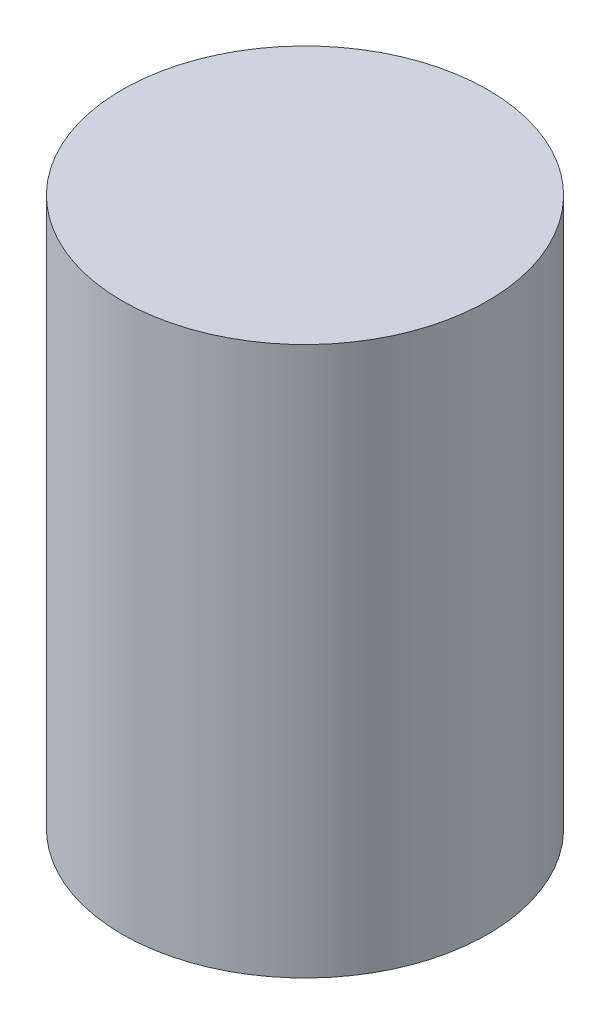
ISO-10303-21;
HEADER;
FILE_DESCRIPTION(('STEP AP214'),'2;1');
FILE_NAME('part.step','',(''),(''),'','','');
FILE_SCHEMA(('AUTOMOTIVE_DESIGN { 1 0 10303 214 1 1 1 1 }'));
ENDSEC;
DATA;
#1=APPLICATION_CONTEXT('core data for automotive mechanical design processes');
#2=APPLICATION_PROTOCOL_DEFINITION('international standard','automotive_design',2000,#1);
#3=PRODUCT_CONTEXT('',#1,'mechanical');
#4=PRODUCT('Part','Part','',(#3));
#5=PRODUCT_RELATED_PRODUCT_CATEGORY('part','',(#4));
#6=PRODUCT_DEFINITION_FORMATION('','',#4);
#7=PRODUCT_DEFINITION_CONTEXT('part definition',#1,'design');
#8=PRODUCT_DEFINITION('design','',#6,#7);
#9=PRODUCT_DEFINITION_SHAPE('','',#8);
#10=(LENGTH_UNIT() NAMED_UNIT(*) SI_UNIT(.MILLI.,.METRE.));
#11=(NAMED_UNIT(*) PLANE_ANGLE_UNIT() SI_UNIT($,.RADIAN.));
#12=(NAMED_UNIT(*) SI_UNIT($,.STERADIAN.) SOLID_ANGLE_UNIT());
#13=UNCERTAINTY_MEASURE_WITH_UNIT(LENGTH_MEASURE(1.E-05),#10,'distance_accuracy_value','');
#14=(GEOMETRIC_REPRESENTATION_CONTEXT(3) GLOBAL_UNCERTAINTY_ASSIGNED_CONTEXT((#13)) GLOBAL_UNIT_ASSIGNED_CONTEXT((#10,
#11,#12)) REPRESENTATION_CONTEXT('',''));
#15=CARTESIAN_POINT('',(0.,0.,0.));
#16=DIRECTION('',(0.,0.,1.));
#17=DIRECTION('',(1.,0.,0.));
#18=AXIS2_PLACEMENT_3D('',#15,#16,#17);
#19=CARTESIAN_POINT('',(0.,9.,0.));
#20=DIRECTION('',(0.,-1.,0.));
#21=DIRECTION('',(0.,0.,-1.));
#22=AXIS2_PLACEMENT_3D('',#19,#20,#21);
#23=CYLINDRICAL_SURFACE('',#22,3.);
#24=CARTESIAN_POINT('',(0.,9.,0.));
#25=DIRECTION('',(0.,1.,0.));
#26=DIRECTION('',(0.,0.,1.));
#27=AXIS2_PLACEMENT_3D('',#24,#25,#26);
#28=CIRCLE('',#27,3.);
#29=CARTESIAN_POINT('',(0.,9.,3.));
#30=VERTEX_POINT('',#29);
#31=EDGE_CURVE('E10',#30,#30,#28,.T.);
#32=ORIENTED_EDGE('',*,*,#31,.F.);
#33=EDGE_LOOP('',(#32));
#34=FACE_BOUND('',#33,.T.);
#35=CARTESIAN_POINT('',(0.,0.,0.));
#36=DIRECTION('',(0.,1.,0.));
#37=DIRECTION('',(0.,0.,1.));
#38=AXIS2_PLACEMENT_3D('',#35,#36,#37);
#39=CIRCLE('',#38,3.);
#40=CARTESIAN_POINT('',(0.,0.,3.));
#41=VERTEX_POINT('',#40);
#42=EDGE_CURVE('E40',#41,#41,#39,.T.);
#43=ORIENTED_EDGE('',*,*,#42,.T.);
#44=EDGE_LOOP('',(#43));
#45=FACE_BOUND('',#44,.T.);
#46=ADVANCED_FACE('F37',(#34,#45),#23,.T.);
#47=CARTESIAN_POINT('',(0.,9.,0.));
#48=DIRECTION('',(0.,1.,0.));
#49=DIRECTION('',(0.,0.,1.));
#50=AXIS2_PLACEMENT_3D('',#47,#48,#49);
#51=PLANE('',#50);
#52=ORIENTED_EDGE('',*,*,#31,.T.);
#53=EDGE_LOOP('',(#52));
#54=FACE_BOUND('',#53,.T.);
#55=ADVANCED_FACE('F54',(#54),#51,.T.);
#56=CARTESIAN_POINT('',(0.,0.,0.));
#57=DIRECTION('',(0.,1.,0.));
#58=DIRECTION('',(0.,0.,1.));
#59=AXIS2_PLACEMENT_3D('',#56,#57,#58);
#60=PLANE('',#59);
#61=ORIENTED_EDGE('',*,*,#42,.F.);
#62=EDGE_LOOP('',(#61));
#63=FACE_BOUND('',#62,.T.);
#64=ADVANCED_FACE('F52',(#63),#60,.F.);
#65=CLOSED_SHELL('',(#46,#55,#64));
#66=MANIFOLD_SOLID_BREP('B2',#65);
#67=ADVANCED_BREP_SHAPE_REPRESENTATION('',(#18,#66),#14);
#68=SHAPE_DEFINITION_REPRESENTATION(#9,#67);
ENDSEC;
END-ISO-10303-21;
